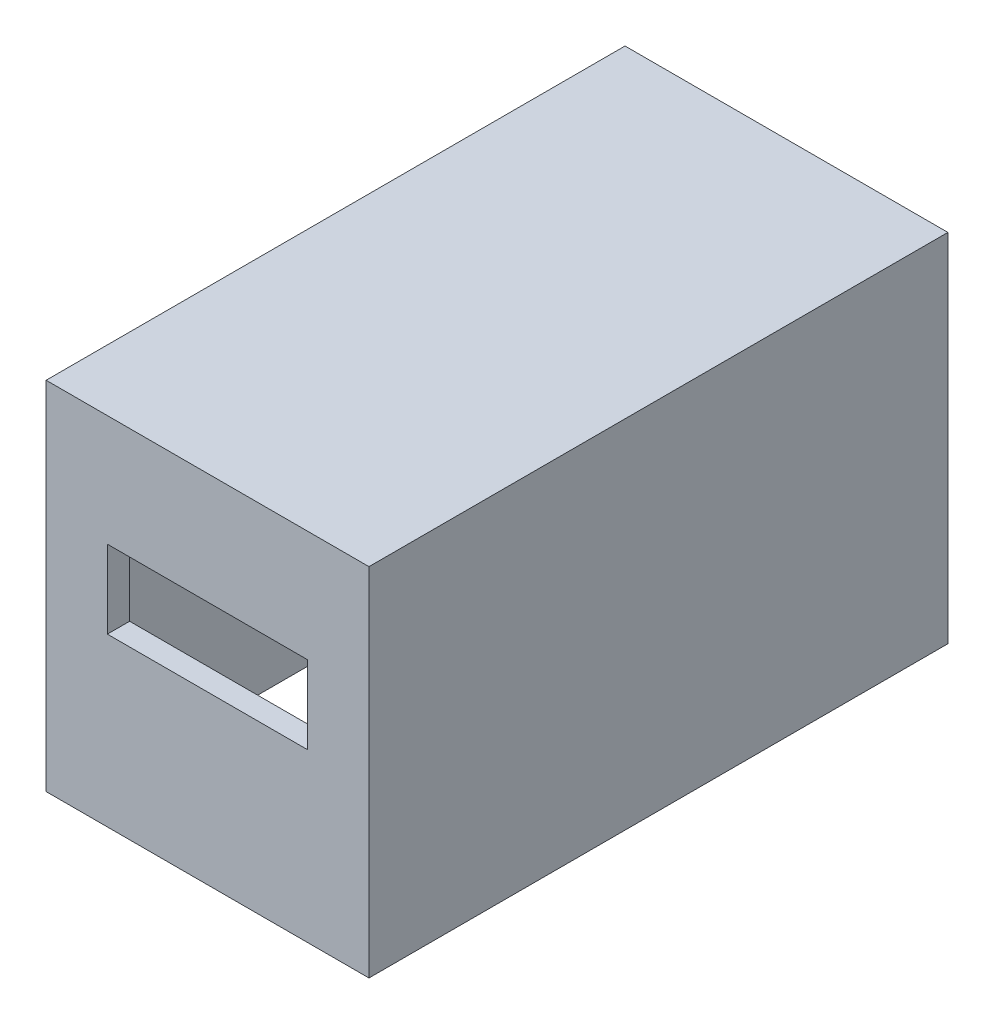
ISO-10303-21;
HEADER;
FILE_DESCRIPTION(('STEP AP214'),'2;1');
FILE_NAME('part.step','',(''),(''),'','','');
FILE_SCHEMA(('AUTOMOTIVE_DESIGN { 1 0 10303 214 1 1 1 1 }'));
ENDSEC;
DATA;
#1=APPLICATION_CONTEXT('core data for automotive mechanical design processes');
#2=APPLICATION_PROTOCOL_DEFINITION('international standard','automotive_design',2000,#1);
#3=PRODUCT_CONTEXT('',#1,'mechanical');
#4=PRODUCT('Part','Part','',(#3));
#5=PRODUCT_RELATED_PRODUCT_CATEGORY('part','',(#4));
#6=PRODUCT_DEFINITION_FORMATION('','',#4);
#7=PRODUCT_DEFINITION_CONTEXT('part definition',#1,'design');
#8=PRODUCT_DEFINITION('design','',#6,#7);
#9=PRODUCT_DEFINITION_SHAPE('','',#8);
#10=(LENGTH_UNIT() NAMED_UNIT(*) SI_UNIT(.MILLI.,.METRE.));
#11=(NAMED_UNIT(*) PLANE_ANGLE_UNIT() SI_UNIT($,.RADIAN.));
#12=(NAMED_UNIT(*) SI_UNIT($,.STERADIAN.) SOLID_ANGLE_UNIT());
#13=UNCERTAINTY_MEASURE_WITH_UNIT(LENGTH_MEASURE(1.E-05),#10,'distance_accuracy_value','');
#14=(GEOMETRIC_REPRESENTATION_CONTEXT(3) GLOBAL_UNCERTAINTY_ASSIGNED_CONTEXT((#13)) GLOBAL_UNIT_ASSIGNED_CONTEXT((#10,
#11,#12)) REPRESENTATION_CONTEXT('',''));
#15=CARTESIAN_POINT('',(0.,0.,0.));
#16=DIRECTION('',(0.,0.,1.));
#17=DIRECTION('',(1.,0.,0.));
#18=AXIS2_PLACEMENT_3D('',#15,#16,#17);
#19=CARTESIAN_POINT('',(-7.25,15.,13.));
#20=DIRECTION('',(0.,0.,-1.));
#21=DIRECTION('',(-1.,0.,0.));
#22=AXIS2_PLACEMENT_3D('',#19,#20,#21);
#23=PLANE('',#22);
#24=DIRECTION('',(1.,0.,0.));
#25=VECTOR('',#24,1.);
#26=CARTESIAN_POINT('',(-7.25,0.,13.));
#27=LINE('',#26,#25);
#28=CARTESIAN_POINT('',(-7.25,0.,13.));
#29=VERTEX_POINT('',#28);
#30=CARTESIAN_POINT('',(7.25,0.,13.));
#31=VERTEX_POINT('',#30);
#32=EDGE_CURVE('E196',#29,#31,#27,.T.);
#33=ORIENTED_EDGE('',*,*,#32,.T.);
#34=DIRECTION('',(0.,-1.,0.));
#35=VECTOR('',#34,1.);
#36=CARTESIAN_POINT('',(7.25,15.,13.));
#37=LINE('',#36,#35);
#38=CARTESIAN_POINT('',(7.25,16.,13.));
#39=VERTEX_POINT('',#38);
#40=EDGE_CURVE('E208',#39,#31,#37,.T.);
#41=ORIENTED_EDGE('',*,*,#40,.F.);
#42=DIRECTION('',(1.,0.,0.));
#43=VECTOR('',#42,1.);
#44=CARTESIAN_POINT('',(-7.25,16.,13.));
#45=LINE('',#44,#43);
#46=CARTESIAN_POINT('',(-7.25,16.,13.));
#47=VERTEX_POINT('',#46);
#48=EDGE_CURVE('E150',#47,#39,#45,.T.);
#49=ORIENTED_EDGE('',*,*,#48,.F.);
#50=DIRECTION('',(0.,-1.,0.));
#51=VECTOR('',#50,1.);
#52=CARTESIAN_POINT('',(-7.25,15.,13.));
#53=LINE('',#52,#51);
#54=EDGE_CURVE('E211',#47,#29,#53,.T.);
#55=ORIENTED_EDGE('',*,*,#54,.T.);
#56=EDGE_LOOP('',(#33,#41,#49,#55));
#57=FACE_BOUND('',#56,.T.);
#58=DIRECTION('',(0.,-1.,0.));
#59=VECTOR('',#58,1.);
#60=CARTESIAN_POINT('',(4.5,0.,13.));
#61=LINE('',#60,#59);
#62=CARTESIAN_POINT('',(4.5,11.,13.));
#63=VERTEX_POINT('',#62);
#64=CARTESIAN_POINT('',(4.5,7.5,13.));
#65=VERTEX_POINT('',#64);
#66=EDGE_CURVE('E47',#63,#65,#61,.T.);
#67=ORIENTED_EDGE('',*,*,#66,.T.);
#68=DIRECTION('',(1.,0.,0.));
#69=VECTOR('',#68,1.);
#70=CARTESIAN_POINT('',(0.,7.5,13.));
#71=LINE('',#70,#69);
#72=CARTESIAN_POINT('',(-4.5,7.5,13.));
#73=VERTEX_POINT('',#72);
#74=EDGE_CURVE('E138',#73,#65,#71,.T.);
#75=ORIENTED_EDGE('',*,*,#74,.F.);
#76=DIRECTION('',(0.,-1.,0.));
#77=VECTOR('',#76,1.);
#78=CARTESIAN_POINT('',(-4.5,0.,13.));
#79=LINE('',#78,#77);
#80=CARTESIAN_POINT('',(-4.5,11.,13.));
#81=VERTEX_POINT('',#80);
#82=EDGE_CURVE('E124',#81,#73,#79,.T.);
#83=ORIENTED_EDGE('',*,*,#82,.F.);
#84=DIRECTION('',(1.,0.,0.));
#85=VECTOR('',#84,1.);
#86=CARTESIAN_POINT('',(0.,11.,13.));
#87=LINE('',#86,#85);
#88=EDGE_CURVE('E133',#81,#63,#87,.T.);
#89=ORIENTED_EDGE('',*,*,#88,.T.);
#90=EDGE_LOOP('',(#67,#75,#83,#89));
#91=FACE_BOUND('',#90,.T.);
#92=ADVANCED_FACE('F32',(#57,#91),#23,.F.);
#93=CARTESIAN_POINT('',(-6.25,15.,12.));
#94=DIRECTION('',(0.,0.,-1.));
#95=DIRECTION('',(-1.,0.,0.));
#96=AXIS2_PLACEMENT_3D('',#93,#94,#95);
#97=PLANE('',#96);
#98=DIRECTION('',(1.,0.,0.));
#99=VECTOR('',#98,1.);
#100=CARTESIAN_POINT('',(-6.25,0.,12.));
#101=LINE('',#100,#99);
#102=CARTESIAN_POINT('',(-6.25,0.,12.));
#103=VERTEX_POINT('',#102);
#104=CARTESIAN_POINT('',(6.25,0.,12.));
#105=VERTEX_POINT('',#104);
#106=EDGE_CURVE('E164',#103,#105,#101,.T.);
#107=ORIENTED_EDGE('',*,*,#106,.F.);
#108=DIRECTION('',(0.,-1.,0.));
#109=VECTOR('',#108,1.);
#110=CARTESIAN_POINT('',(-6.25,15.,12.));
#111=LINE('',#110,#109);
#112=CARTESIAN_POINT('',(-6.25,15.,12.));
#113=VERTEX_POINT('',#112);
#114=EDGE_CURVE('E186',#113,#103,#111,.T.);
#115=ORIENTED_EDGE('',*,*,#114,.F.);
#116=DIRECTION('',(1.,0.,0.));
#117=VECTOR('',#116,1.);
#118=CARTESIAN_POINT('',(-6.25,15.,12.));
#119=LINE('',#118,#117);
#120=CARTESIAN_POINT('',(6.25,15.,12.));
#121=VERTEX_POINT('',#120);
#122=EDGE_CURVE('E170',#113,#121,#119,.T.);
#123=ORIENTED_EDGE('',*,*,#122,.T.);
#124=DIRECTION('',(0.,-1.,0.));
#125=VECTOR('',#124,1.);
#126=CARTESIAN_POINT('',(6.25,15.,12.));
#127=LINE('',#126,#125);
#128=EDGE_CURVE('E173',#121,#105,#127,.T.);
#129=ORIENTED_EDGE('',*,*,#128,.T.);
#130=EDGE_LOOP('',(#107,#115,#123,#129));
#131=FACE_BOUND('',#130,.T.);
#132=DIRECTION('',(-1.,0.,0.));
#133=VECTOR('',#132,1.);
#134=CARTESIAN_POINT('',(-6.25,7.5,12.));
#135=LINE('',#134,#133);
#136=CARTESIAN_POINT('',(4.5,7.5,12.));
#137=VERTEX_POINT('',#136);
#138=CARTESIAN_POINT('',(-4.5,7.5,12.));
#139=VERTEX_POINT('',#138);
#140=EDGE_CURVE('E40',#137,#139,#135,.T.);
#141=ORIENTED_EDGE('',*,*,#140,.F.);
#142=DIRECTION('',(0.,1.,0.));
#143=VECTOR('',#142,1.);
#144=CARTESIAN_POINT('',(4.5,15.,12.));
#145=LINE('',#144,#143);
#146=CARTESIAN_POINT('',(4.5,11.,12.));
#147=VERTEX_POINT('',#146);
#148=EDGE_CURVE('E11',#137,#147,#145,.T.);
#149=ORIENTED_EDGE('',*,*,#148,.T.);
#150=DIRECTION('',(-1.,0.,0.));
#151=VECTOR('',#150,1.);
#152=CARTESIAN_POINT('',(-6.25,11.,12.));
#153=LINE('',#152,#151);
#154=CARTESIAN_POINT('',(-4.5,11.,12.));
#155=VERTEX_POINT('',#154);
#156=EDGE_CURVE('E214',#147,#155,#153,.T.);
#157=ORIENTED_EDGE('',*,*,#156,.T.);
#158=DIRECTION('',(0.,1.,0.));
#159=VECTOR('',#158,1.);
#160=CARTESIAN_POINT('',(-4.5,15.,12.));
#161=LINE('',#160,#159);
#162=EDGE_CURVE('E127',#139,#155,#161,.T.);
#163=ORIENTED_EDGE('',*,*,#162,.F.);
#164=EDGE_LOOP('',(#141,#149,#157,#163));
#165=FACE_BOUND('',#164,.T.);
#166=ADVANCED_FACE('F221',(#131,#165),#97,.T.);
#167=CARTESIAN_POINT('',(0.,0.,0.));
#168=DIRECTION('',(0.,-1.,0.));
#169=DIRECTION('',(0.,0.,-1.));
#170=AXIS2_PLACEMENT_3D('',#167,#168,#169);
#171=PLANE('',#170);
#172=DIRECTION('',(0.,0.,1.));
#173=VECTOR('',#172,1.);
#174=CARTESIAN_POINT('',(-7.25,0.,13.));
#175=LINE('',#174,#173);
#176=CARTESIAN_POINT('',(-7.25,0.,-13.));
#177=VERTEX_POINT('',#176);
#178=EDGE_CURVE('E193',#177,#29,#175,.T.);
#179=ORIENTED_EDGE('',*,*,#178,.F.);
#180=DIRECTION('',(-1.,0.,0.));
#181=VECTOR('',#180,1.);
#182=CARTESIAN_POINT('',(-7.25,0.,-13.));
#183=LINE('',#182,#181);
#184=CARTESIAN_POINT('',(7.25,0.,-13.));
#185=VERTEX_POINT('',#184);
#186=EDGE_CURVE('E200',#185,#177,#183,.T.);
#187=ORIENTED_EDGE('',*,*,#186,.F.);
#188=DIRECTION('',(0.,0.,-1.));
#189=VECTOR('',#188,1.);
#190=CARTESIAN_POINT('',(7.25,0.,13.));
#191=LINE('',#190,#189);
#192=EDGE_CURVE('E198',#31,#185,#191,.T.);
#193=ORIENTED_EDGE('',*,*,#192,.F.);
#194=ORIENTED_EDGE('',*,*,#32,.F.);
#195=EDGE_LOOP('',(#179,#187,#193,#194));
#196=FACE_BOUND('',#195,.T.);
#197=ORIENTED_EDGE('',*,*,#106,.T.);
#198=DIRECTION('',(0.,0.,-1.));
#199=VECTOR('',#198,1.);
#200=CARTESIAN_POINT('',(6.25,0.,12.));
#201=LINE('',#200,#199);
#202=CARTESIAN_POINT('',(6.25,0.,-12.));
#203=VERTEX_POINT('',#202);
#204=EDGE_CURVE('E159',#105,#203,#201,.T.);
#205=ORIENTED_EDGE('',*,*,#204,.T.);
#206=DIRECTION('',(-1.,0.,0.));
#207=VECTOR('',#206,1.);
#208=CARTESIAN_POINT('',(-6.25,0.,-12.));
#209=LINE('',#208,#207);
#210=CARTESIAN_POINT('',(-6.25,0.,-12.));
#211=VERTEX_POINT('',#210);
#212=EDGE_CURVE('E176',#203,#211,#209,.T.);
#213=ORIENTED_EDGE('',*,*,#212,.T.);
#214=DIRECTION('',(0.,0.,1.));
#215=VECTOR('',#214,1.);
#216=CARTESIAN_POINT('',(-6.25,0.,12.));
#217=LINE('',#216,#215);
#218=EDGE_CURVE('E179',#211,#103,#217,.T.);
#219=ORIENTED_EDGE('',*,*,#218,.T.);
#220=EDGE_LOOP('',(#197,#205,#213,#219));
#221=FACE_BOUND('',#220,.T.);
#222=ADVANCED_FACE('F240',(#196,#221),#171,.T.);
#223=CARTESIAN_POINT('',(-7.25,15.,13.));
#224=DIRECTION('',(1.,0.,0.));
#225=DIRECTION('',(0.,0.,-1.));
#226=AXIS2_PLACEMENT_3D('',#223,#224,#225);
#227=PLANE('',#226);
#228=ORIENTED_EDGE('',*,*,#178,.T.);
#229=ORIENTED_EDGE('',*,*,#54,.F.);
#230=DIRECTION('',(0.,0.,1.));
#231=VECTOR('',#230,1.);
#232=CARTESIAN_POINT('',(-7.25,16.,-13.));
#233=LINE('',#232,#231);
#234=CARTESIAN_POINT('',(-7.25,16.,-13.));
#235=VERTEX_POINT('',#234);
#236=EDGE_CURVE('E145',#235,#47,#233,.T.);
#237=ORIENTED_EDGE('',*,*,#236,.F.);
#238=DIRECTION('',(0.,-1.,0.));
#239=VECTOR('',#238,1.);
#240=CARTESIAN_POINT('',(-7.25,15.,-13.));
#241=LINE('',#240,#239);
#242=EDGE_CURVE('E202',#235,#177,#241,.T.);
#243=ORIENTED_EDGE('',*,*,#242,.T.);
#244=EDGE_LOOP('',(#228,#229,#237,#243));
#245=FACE_BOUND('',#244,.T.);
#246=ADVANCED_FACE('F34',(#245),#227,.F.);
#247=CARTESIAN_POINT('',(7.25,15.,13.));
#248=DIRECTION('',(-1.,0.,0.));
#249=DIRECTION('',(0.,0.,1.));
#250=AXIS2_PLACEMENT_3D('',#247,#248,#249);
#251=PLANE('',#250);
#252=ORIENTED_EDGE('',*,*,#192,.T.);
#253=DIRECTION('',(0.,-1.,0.));
#254=VECTOR('',#253,1.);
#255=CARTESIAN_POINT('',(7.25,15.,-13.));
#256=LINE('',#255,#254);
#257=CARTESIAN_POINT('',(7.25,16.,-13.));
#258=VERTEX_POINT('',#257);
#259=EDGE_CURVE('E205',#258,#185,#256,.T.);
#260=ORIENTED_EDGE('',*,*,#259,.F.);
#261=DIRECTION('',(0.,0.,-1.));
#262=VECTOR('',#261,1.);
#263=CARTESIAN_POINT('',(7.25,16.,13.));
#264=LINE('',#263,#262);
#265=EDGE_CURVE('E153',#39,#258,#264,.T.);
#266=ORIENTED_EDGE('',*,*,#265,.F.);
#267=ORIENTED_EDGE('',*,*,#40,.T.);
#268=EDGE_LOOP('',(#252,#260,#266,#267));
#269=FACE_BOUND('',#268,.T.);
#270=ADVANCED_FACE('F244',(#269),#251,.F.);
#271=CARTESIAN_POINT('',(-7.25,15.,-13.));
#272=DIRECTION('',(0.,0.,1.));
#273=DIRECTION('',(1.,0.,0.));
#274=AXIS2_PLACEMENT_3D('',#271,#272,#273);
#275=PLANE('',#274);
#276=ORIENTED_EDGE('',*,*,#186,.T.);
#277=ORIENTED_EDGE('',*,*,#242,.F.);
#278=DIRECTION('',(-1.,0.,0.));
#279=VECTOR('',#278,1.);
#280=CARTESIAN_POINT('',(7.25,16.,-13.));
#281=LINE('',#280,#279);
#282=EDGE_CURVE('E156',#258,#235,#281,.T.);
#283=ORIENTED_EDGE('',*,*,#282,.F.);
#284=ORIENTED_EDGE('',*,*,#259,.T.);
#285=EDGE_LOOP('',(#276,#277,#283,#284));
#286=FACE_BOUND('',#285,.T.);
#287=ADVANCED_FACE('F247',(#286),#275,.F.);
#288=CARTESIAN_POINT('',(6.25,15.,12.));
#289=DIRECTION('',(-1.,0.,0.));
#290=DIRECTION('',(0.,0.,1.));
#291=AXIS2_PLACEMENT_3D('',#288,#289,#290);
#292=PLANE('',#291);
#293=ORIENTED_EDGE('',*,*,#204,.F.);
#294=ORIENTED_EDGE('',*,*,#128,.F.);
#295=DIRECTION('',(0.,0.,-1.));
#296=VECTOR('',#295,1.);
#297=CARTESIAN_POINT('',(6.25,15.,12.));
#298=LINE('',#297,#296);
#299=CARTESIAN_POINT('',(6.25,15.,-12.));
#300=VERTEX_POINT('',#299);
#301=EDGE_CURVE('E160',#121,#300,#298,.T.);
#302=ORIENTED_EDGE('',*,*,#301,.T.);
#303=DIRECTION('',(0.,-1.,0.));
#304=VECTOR('',#303,1.);
#305=CARTESIAN_POINT('',(6.25,15.,-12.));
#306=LINE('',#305,#304);
#307=EDGE_CURVE('E190',#300,#203,#306,.T.);
#308=ORIENTED_EDGE('',*,*,#307,.T.);
#309=EDGE_LOOP('',(#293,#294,#302,#308));
#310=FACE_BOUND('',#309,.T.);
#311=ADVANCED_FACE('F251',(#310),#292,.T.);
#312=CARTESIAN_POINT('',(-6.25,15.,-12.));
#313=DIRECTION('',(0.,0.,1.));
#314=DIRECTION('',(1.,0.,0.));
#315=AXIS2_PLACEMENT_3D('',#312,#313,#314);
#316=PLANE('',#315);
#317=ORIENTED_EDGE('',*,*,#212,.F.);
#318=ORIENTED_EDGE('',*,*,#307,.F.);
#319=DIRECTION('',(-1.,0.,0.));
#320=VECTOR('',#319,1.);
#321=CARTESIAN_POINT('',(-6.25,15.,-12.));
#322=LINE('',#321,#320);
#323=CARTESIAN_POINT('',(-6.25,15.,-12.));
#324=VERTEX_POINT('',#323);
#325=EDGE_CURVE('E163',#300,#324,#322,.T.);
#326=ORIENTED_EDGE('',*,*,#325,.T.);
#327=DIRECTION('',(0.,-1.,0.));
#328=VECTOR('',#327,1.);
#329=CARTESIAN_POINT('',(-6.25,15.,-12.));
#330=LINE('',#329,#328);
#331=EDGE_CURVE('E188',#324,#211,#330,.T.);
#332=ORIENTED_EDGE('',*,*,#331,.T.);
#333=EDGE_LOOP('',(#317,#318,#326,#332));
#334=FACE_BOUND('',#333,.T.);
#335=ADVANCED_FACE('F258',(#334),#316,.T.);
#336=CARTESIAN_POINT('',(-6.25,15.,12.));
#337=DIRECTION('',(1.,0.,0.));
#338=DIRECTION('',(0.,0.,-1.));
#339=AXIS2_PLACEMENT_3D('',#336,#337,#338);
#340=PLANE('',#339);
#341=ORIENTED_EDGE('',*,*,#218,.F.);
#342=ORIENTED_EDGE('',*,*,#331,.F.);
#343=DIRECTION('',(0.,0.,1.));
#344=VECTOR('',#343,1.);
#345=CARTESIAN_POINT('',(-6.25,15.,12.));
#346=LINE('',#345,#344);
#347=EDGE_CURVE('E167',#324,#113,#346,.T.);
#348=ORIENTED_EDGE('',*,*,#347,.T.);
#349=ORIENTED_EDGE('',*,*,#114,.T.);
#350=EDGE_LOOP('',(#341,#342,#348,#349));
#351=FACE_BOUND('',#350,.T.);
#352=ADVANCED_FACE('F262',(#351),#340,.T.);
#353=CARTESIAN_POINT('',(0.,15.,0.));
#354=DIRECTION('',(0.,1.,0.));
#355=DIRECTION('',(0.,0.,1.));
#356=AXIS2_PLACEMENT_3D('',#353,#354,#355);
#357=PLANE('',#356);
#358=ORIENTED_EDGE('',*,*,#301,.F.);
#359=ORIENTED_EDGE('',*,*,#122,.F.);
#360=ORIENTED_EDGE('',*,*,#347,.F.);
#361=ORIENTED_EDGE('',*,*,#325,.F.);
#362=EDGE_LOOP('',(#358,#359,#360,#361));
#363=FACE_BOUND('',#362,.T.);
#364=ADVANCED_FACE('F231',(#363),#357,.F.);
#365=CARTESIAN_POINT('',(0.,16.,0.));
#366=DIRECTION('',(0.,1.,0.));
#367=DIRECTION('',(0.,0.,1.));
#368=AXIS2_PLACEMENT_3D('',#365,#366,#367);
#369=PLANE('',#368);
#370=ORIENTED_EDGE('',*,*,#236,.T.);
#371=ORIENTED_EDGE('',*,*,#48,.T.);
#372=ORIENTED_EDGE('',*,*,#265,.T.);
#373=ORIENTED_EDGE('',*,*,#282,.T.);
#374=EDGE_LOOP('',(#370,#371,#372,#373));
#375=FACE_BOUND('',#374,.T.);
#376=ADVANCED_FACE('F224',(#375),#369,.T.);
#377=CARTESIAN_POINT('',(4.5,0.,11.));
#378=DIRECTION('',(-1.,0.,0.));
#379=DIRECTION('',(0.,0.,1.));
#380=AXIS2_PLACEMENT_3D('',#377,#378,#379);
#381=PLANE('',#380);
#382=DIRECTION('',(0.,0.,1.));
#383=VECTOR('',#382,1.);
#384=CARTESIAN_POINT('',(4.5,7.5,11.));
#385=LINE('',#384,#383);
#386=EDGE_CURVE('E143',#137,#65,#385,.T.);
#387=ORIENTED_EDGE('',*,*,#386,.T.);
#388=ORIENTED_EDGE('',*,*,#66,.F.);
#389=DIRECTION('',(0.,0.,1.));
#390=VECTOR('',#389,1.);
#391=CARTESIAN_POINT('',(4.5,11.,11.));
#392=LINE('',#391,#390);
#393=EDGE_CURVE('E130',#147,#63,#392,.T.);
#394=ORIENTED_EDGE('',*,*,#393,.F.);
#395=ORIENTED_EDGE('',*,*,#148,.F.);
#396=EDGE_LOOP('',(#387,#388,#394,#395));
#397=FACE_BOUND('',#396,.T.);
#398=ADVANCED_FACE('F222',(#397),#381,.T.);
#399=CARTESIAN_POINT('',(0.,7.5,11.));
#400=DIRECTION('',(0.,-1.,0.));
#401=DIRECTION('',(1.,0.,0.));
#402=AXIS2_PLACEMENT_3D('',#399,#400,#401);
#403=PLANE('',#402);
#404=ORIENTED_EDGE('',*,*,#140,.T.);
#405=DIRECTION('',(0.,0.,1.));
#406=VECTOR('',#405,1.);
#407=CARTESIAN_POINT('',(-4.5,7.5,11.));
#408=LINE('',#407,#406);
#409=EDGE_CURVE('E129',#139,#73,#408,.T.);
#410=ORIENTED_EDGE('',*,*,#409,.T.);
#411=ORIENTED_EDGE('',*,*,#74,.T.);
#412=ORIENTED_EDGE('',*,*,#386,.F.);
#413=EDGE_LOOP('',(#404,#410,#411,#412));
#414=FACE_BOUND('',#413,.T.);
#415=ADVANCED_FACE('F219',(#414),#403,.F.);
#416=CARTESIAN_POINT('',(-4.5,0.,11.));
#417=DIRECTION('',(-1.,0.,0.));
#418=DIRECTION('',(0.,0.,1.));
#419=AXIS2_PLACEMENT_3D('',#416,#417,#418);
#420=PLANE('',#419);
#421=ORIENTED_EDGE('',*,*,#162,.T.);
#422=DIRECTION('',(0.,0.,1.));
#423=VECTOR('',#422,1.);
#424=CARTESIAN_POINT('',(-4.5,11.,11.));
#425=LINE('',#424,#423);
#426=EDGE_CURVE('E55',#155,#81,#425,.T.);
#427=ORIENTED_EDGE('',*,*,#426,.T.);
#428=ORIENTED_EDGE('',*,*,#82,.T.);
#429=ORIENTED_EDGE('',*,*,#409,.F.);
#430=EDGE_LOOP('',(#421,#427,#428,#429));
#431=FACE_BOUND('',#430,.T.);
#432=ADVANCED_FACE('F121',(#431),#420,.F.);
#433=CARTESIAN_POINT('',(0.,11.,11.));
#434=DIRECTION('',(0.,-1.,0.));
#435=DIRECTION('',(1.,0.,0.));
#436=AXIS2_PLACEMENT_3D('',#433,#434,#435);
#437=PLANE('',#436);
#438=ORIENTED_EDGE('',*,*,#393,.T.);
#439=ORIENTED_EDGE('',*,*,#88,.F.);
#440=ORIENTED_EDGE('',*,*,#426,.F.);
#441=ORIENTED_EDGE('',*,*,#156,.F.);
#442=EDGE_LOOP('',(#438,#439,#440,#441));
#443=FACE_BOUND('',#442,.T.);
#444=ADVANCED_FACE('F134',(#443),#437,.T.);
#445=CLOSED_SHELL('',(#92,#166,#222,#246,#270,#287,#311,#335,#352,#364,#376,#398,#415,#432,#444));
#446=MANIFOLD_SOLID_BREP('B2',#445);
#447=ADVANCED_BREP_SHAPE_REPRESENTATION('',(#18,#446),#14);
#448=SHAPE_DEFINITION_REPRESENTATION(#9,#447);
ENDSEC;
END-ISO-10303-21;
